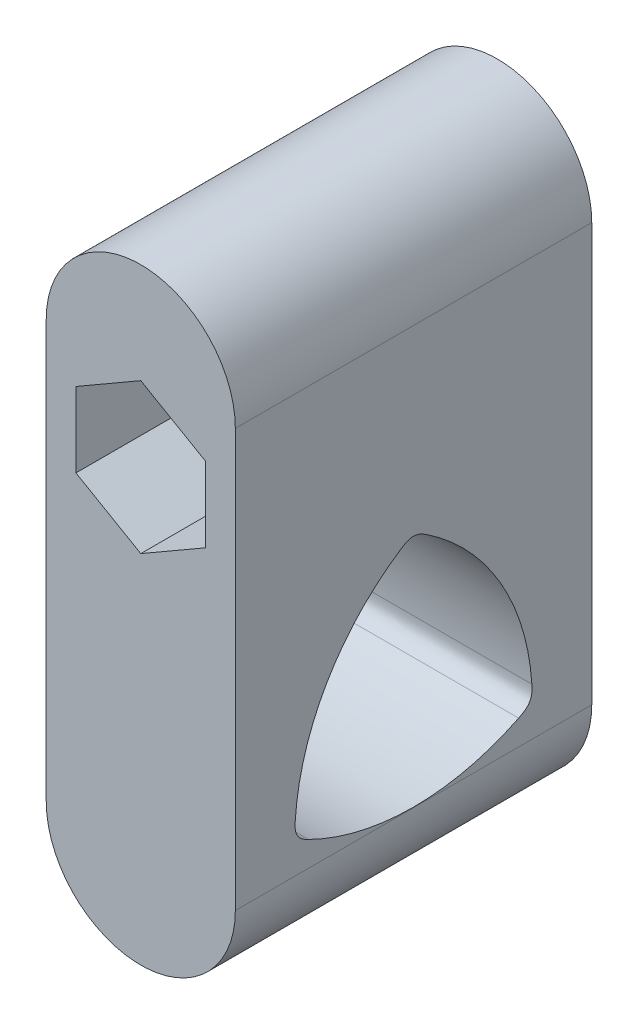
ISO-10303-21;
HEADER;
FILE_DESCRIPTION(('STEP AP214'),'2;1');
FILE_NAME('part.step','',(''),(''),'','','');
FILE_SCHEMA(('AUTOMOTIVE_DESIGN { 1 0 10303 214 1 1 1 1 }'));
ENDSEC;
DATA;
#1=APPLICATION_CONTEXT('core data for automotive mechanical design processes');
#2=APPLICATION_PROTOCOL_DEFINITION('international standard','automotive_design',2000,#1);
#3=PRODUCT_CONTEXT('',#1,'mechanical');
#4=PRODUCT('Part','Part','',(#3));
#5=PRODUCT_RELATED_PRODUCT_CATEGORY('part','',(#4));
#6=PRODUCT_DEFINITION_FORMATION('','',#4);
#7=PRODUCT_DEFINITION_CONTEXT('part definition',#1,'design');
#8=PRODUCT_DEFINITION('design','',#6,#7);
#9=PRODUCT_DEFINITION_SHAPE('','',#8);
#10=(LENGTH_UNIT() NAMED_UNIT(*) SI_UNIT(.MILLI.,.METRE.));
#11=(NAMED_UNIT(*) PLANE_ANGLE_UNIT() SI_UNIT($,.RADIAN.));
#12=(NAMED_UNIT(*) SI_UNIT($,.STERADIAN.) SOLID_ANGLE_UNIT());
#13=UNCERTAINTY_MEASURE_WITH_UNIT(LENGTH_MEASURE(1.E-05),#10,'distance_accuracy_value','');
#14=(GEOMETRIC_REPRESENTATION_CONTEXT(3) GLOBAL_UNCERTAINTY_ASSIGNED_CONTEXT((#13)) GLOBAL_UNIT_ASSIGNED_CONTEXT((#10,
#11,#12)) REPRESENTATION_CONTEXT('',''));
#15=CARTESIAN_POINT('',(0.,0.,0.));
#16=DIRECTION('',(0.,0.,1.));
#17=DIRECTION('',(1.,0.,0.));
#18=AXIS2_PLACEMENT_3D('',#15,#16,#17);
#19=CARTESIAN_POINT('',(0.,-34.0132885263841,18.));
#20=DIRECTION('',(0.,0.,1.));
#21=DIRECTION('',(1.,0.,0.));
#22=AXIS2_PLACEMENT_3D('',#19,#20,#21);
#23=PLANE('',#22);
#24=CARTESIAN_POINT('',(0.,-34.0132885263841,18.));
#25=DIRECTION('',(0.,0.,1.));
#26=DIRECTION('',(1.,0.,0.));
#27=AXIS2_PLACEMENT_3D('',#24,#25,#26);
#28=CIRCLE('',#27,9.55);
#29=CARTESIAN_POINT('',(-9.54999999999999,-34.0132885263841,18.));
#30=VERTEX_POINT('',#29);
#31=CARTESIAN_POINT('',(9.55,-34.0132885263841,18.));
#32=VERTEX_POINT('',#31);
#33=EDGE_CURVE('E216',#30,#32,#28,.T.);
#34=ORIENTED_EDGE('',*,*,#33,.T.);
#35=DIRECTION('',(0.,1.,0.));
#36=VECTOR('',#35,1.);
#37=CARTESIAN_POINT('',(9.55,-34.0132885263841,18.));
#38=LINE('',#37,#36);
#39=CARTESIAN_POINT('',(9.55,8.1632885263841,18.));
#40=VERTEX_POINT('',#39);
#41=EDGE_CURVE('E219',#32,#40,#38,.T.);
#42=ORIENTED_EDGE('',*,*,#41,.T.);
#43=CARTESIAN_POINT('',(0.,8.1632885263841,18.));
#44=DIRECTION('',(0.,0.,1.));
#45=DIRECTION('',(1.,0.,0.));
#46=AXIS2_PLACEMENT_3D('',#43,#44,#45);
#47=CIRCLE('',#46,9.55);
#48=CARTESIAN_POINT('',(-9.55,8.1632885263841,18.));
#49=VERTEX_POINT('',#48);
#50=EDGE_CURVE('E222',#40,#49,#47,.T.);
#51=ORIENTED_EDGE('',*,*,#50,.T.);
#52=DIRECTION('',(0.,-1.,0.));
#53=VECTOR('',#52,1.);
#54=CARTESIAN_POINT('',(-9.55,8.1632885263841,18.));
#55=LINE('',#54,#53);
#56=EDGE_CURVE('E224',#49,#30,#55,.T.);
#57=ORIENTED_EDGE('',*,*,#56,.T.);
#58=EDGE_LOOP('',(#34,#42,#51,#57));
#59=FACE_BOUND('',#58,.T.);
#60=DIRECTION('',(0.,1.,0.));
#61=VECTOR('',#60,1.);
#62=CARTESIAN_POINT('',(6.55,-3.78164426319204,18.));
#63=LINE('',#62,#61);
#64=CARTESIAN_POINT('',(6.55,-3.78164426319204,18.));
#65=VERTEX_POINT('',#64);
#66=CARTESIAN_POINT('',(6.55,3.78164426319205,18.));
#67=VERTEX_POINT('',#66);
#68=EDGE_CURVE('E168',#65,#67,#63,.T.);
#69=ORIENTED_EDGE('',*,*,#68,.F.);
#70=DIRECTION('',(0.866025403784438,0.500000000000001,0.));
#71=VECTOR('',#70,1.);
#72=CARTESIAN_POINT('',(0.,-7.5632885263841,18.));
#73=LINE('',#72,#71);
#74=CARTESIAN_POINT('',(0.,-7.5632885263841,18.));
#75=VERTEX_POINT('',#74);
#76=EDGE_CURVE('E158',#75,#65,#73,.T.);
#77=ORIENTED_EDGE('',*,*,#76,.F.);
#78=DIRECTION('',(0.866025403784439,-0.5,0.));
#79=VECTOR('',#78,1.);
#80=CARTESIAN_POINT('',(-6.55,-3.78164426319205,18.));
#81=LINE('',#80,#79);
#82=CARTESIAN_POINT('',(-6.54999999999999,-3.78164426319205,18.));
#83=VERTEX_POINT('',#82);
#84=EDGE_CURVE('E191',#83,#75,#81,.T.);
#85=ORIENTED_EDGE('',*,*,#84,.F.);
#86=DIRECTION('',(0.,-1.,0.));
#87=VECTOR('',#86,1.);
#88=CARTESIAN_POINT('',(-6.55,3.78164426319205,18.));
#89=LINE('',#88,#87);
#90=CARTESIAN_POINT('',(-6.55,3.78164426319205,18.));
#91=VERTEX_POINT('',#90);
#92=EDGE_CURVE('E188',#91,#83,#89,.T.);
#93=ORIENTED_EDGE('',*,*,#92,.F.);
#94=DIRECTION('',(-0.866025403784439,-0.5,0.));
#95=VECTOR('',#94,1.);
#96=CARTESIAN_POINT('',(0.,7.5632885263841,18.));
#97=LINE('',#96,#95);
#98=CARTESIAN_POINT('',(0.,7.5632885263841,18.));
#99=VERTEX_POINT('',#98);
#100=EDGE_CURVE('E183',#99,#91,#97,.T.);
#101=ORIENTED_EDGE('',*,*,#100,.F.);
#102=DIRECTION('',(-0.866025403784439,0.5,0.));
#103=VECTOR('',#102,1.);
#104=CARTESIAN_POINT('',(6.55,3.78164426319205,18.));
#105=LINE('',#104,#103);
#106=EDGE_CURVE('E181',#67,#99,#105,.T.);
#107=ORIENTED_EDGE('',*,*,#106,.F.);
#108=EDGE_LOOP('',(#69,#77,#85,#93,#101,#107));
#109=FACE_BOUND('',#108,.T.);
#110=ADVANCED_FACE('F35',(#59,#109),#23,.T.);
#111=CARTESIAN_POINT('',(0.,-34.0132885263841,-18.));
#112=DIRECTION('',(0.,0.,1.));
#113=DIRECTION('',(1.,0.,0.));
#114=AXIS2_PLACEMENT_3D('',#111,#112,#113);
#115=PLANE('',#114);
#116=CARTESIAN_POINT('',(0.,-34.0132885263841,-18.));
#117=DIRECTION('',(0.,0.,1.));
#118=DIRECTION('',(1.,0.,0.));
#119=AXIS2_PLACEMENT_3D('',#116,#117,#118);
#120=CIRCLE('',#119,9.55);
#121=CARTESIAN_POINT('',(-9.54999999999999,-34.0132885263841,-18.));
#122=VERTEX_POINT('',#121);
#123=CARTESIAN_POINT('',(9.55,-34.0132885263841,-18.));
#124=VERTEX_POINT('',#123);
#125=EDGE_CURVE('E176',#122,#124,#120,.T.);
#126=ORIENTED_EDGE('',*,*,#125,.F.);
#127=DIRECTION('',(0.,-1.,0.));
#128=VECTOR('',#127,1.);
#129=CARTESIAN_POINT('',(-9.55,8.1632885263841,-18.));
#130=LINE('',#129,#128);
#131=CARTESIAN_POINT('',(-9.55,8.1632885263841,-18.));
#132=VERTEX_POINT('',#131);
#133=EDGE_CURVE('E220',#132,#122,#130,.T.);
#134=ORIENTED_EDGE('',*,*,#133,.F.);
#135=CARTESIAN_POINT('',(0.,8.1632885263841,-18.));
#136=DIRECTION('',(0.,0.,1.));
#137=DIRECTION('',(1.,0.,0.));
#138=AXIS2_PLACEMENT_3D('',#135,#136,#137);
#139=CIRCLE('',#138,9.55);
#140=CARTESIAN_POINT('',(9.55,8.1632885263841,-18.));
#141=VERTEX_POINT('',#140);
#142=EDGE_CURVE('E231',#141,#132,#139,.T.);
#143=ORIENTED_EDGE('',*,*,#142,.F.);
#144=DIRECTION('',(0.,1.,0.));
#145=VECTOR('',#144,1.);
#146=CARTESIAN_POINT('',(9.55,-34.0132885263841,-18.));
#147=LINE('',#146,#145);
#148=EDGE_CURVE('E229',#124,#141,#147,.T.);
#149=ORIENTED_EDGE('',*,*,#148,.F.);
#150=EDGE_LOOP('',(#126,#134,#143,#149));
#151=FACE_BOUND('',#150,.T.);
#152=DIRECTION('',(0.866025403784438,0.500000000000001,0.));
#153=VECTOR('',#152,1.);
#154=CARTESIAN_POINT('',(0.,-7.5632885263841,-18.));
#155=LINE('',#154,#153);
#156=CARTESIAN_POINT('',(0.,-7.5632885263841,-18.));
#157=VERTEX_POINT('',#156);
#158=CARTESIAN_POINT('',(6.55,-3.78164426319204,-18.));
#159=VERTEX_POINT('',#158);
#160=EDGE_CURVE('E193',#157,#159,#155,.T.);
#161=ORIENTED_EDGE('',*,*,#160,.T.);
#162=DIRECTION('',(0.,1.,0.));
#163=VECTOR('',#162,1.);
#164=CARTESIAN_POINT('',(6.55,-3.78164426319204,-18.));
#165=LINE('',#164,#163);
#166=CARTESIAN_POINT('',(6.55,3.78164426319205,-18.));
#167=VERTEX_POINT('',#166);
#168=EDGE_CURVE('E175',#159,#167,#165,.T.);
#169=ORIENTED_EDGE('',*,*,#168,.T.);
#170=DIRECTION('',(-0.866025403784439,0.5,0.));
#171=VECTOR('',#170,1.);
#172=CARTESIAN_POINT('',(6.55,3.78164426319205,-18.));
#173=LINE('',#172,#171);
#174=CARTESIAN_POINT('',(0.,7.5632885263841,-18.));
#175=VERTEX_POINT('',#174);
#176=EDGE_CURVE('E197',#167,#175,#173,.T.);
#177=ORIENTED_EDGE('',*,*,#176,.T.);
#178=DIRECTION('',(-0.866025403784439,-0.5,0.));
#179=VECTOR('',#178,1.);
#180=CARTESIAN_POINT('',(0.,7.5632885263841,-18.));
#181=LINE('',#180,#179);
#182=CARTESIAN_POINT('',(-6.55,3.78164426319205,-18.));
#183=VERTEX_POINT('',#182);
#184=EDGE_CURVE('E200',#175,#183,#181,.T.);
#185=ORIENTED_EDGE('',*,*,#184,.T.);
#186=DIRECTION('',(0.,-1.,0.));
#187=VECTOR('',#186,1.);
#188=CARTESIAN_POINT('',(-6.55,3.78164426319205,-18.));
#189=LINE('',#188,#187);
#190=CARTESIAN_POINT('',(-6.55,-3.78164426319205,-18.));
#191=VERTEX_POINT('',#190);
#192=EDGE_CURVE('E203',#183,#191,#189,.T.);
#193=ORIENTED_EDGE('',*,*,#192,.T.);
#194=DIRECTION('',(0.866025403784439,-0.5,0.));
#195=VECTOR('',#194,1.);
#196=CARTESIAN_POINT('',(-6.55,-3.78164426319205,-18.));
#197=LINE('',#196,#195);
#198=EDGE_CURVE('E169',#191,#157,#197,.T.);
#199=ORIENTED_EDGE('',*,*,#198,.T.);
#200=EDGE_LOOP('',(#161,#169,#177,#185,#193,#199));
#201=FACE_BOUND('',#200,.T.);
#202=ADVANCED_FACE('F356',(#151,#201),#115,.F.);
#203=CARTESIAN_POINT('',(0.,-34.0132885263841,18.));
#204=DIRECTION('',(0.,0.,-1.));
#205=DIRECTION('',(-1.,0.,0.));
#206=AXIS2_PLACEMENT_3D('',#203,#204,#205);
#207=CYLINDRICAL_SURFACE('',#206,9.55);
#208=ORIENTED_EDGE('',*,*,#125,.T.);
#209=DIRECTION('',(0.,0.,-1.));
#210=VECTOR('',#209,1.);
#211=CARTESIAN_POINT('',(9.55,-34.0132885263841,18.));
#212=LINE('',#211,#210);
#213=EDGE_CURVE('E242',#32,#124,#212,.T.);
#214=ORIENTED_EDGE('',*,*,#213,.F.);
#215=ORIENTED_EDGE('',*,*,#33,.F.);
#216=DIRECTION('',(0.,0.,-1.));
#217=VECTOR('',#216,1.);
#218=CARTESIAN_POINT('',(-9.54999999999999,-34.0132885263841,18.));
#219=LINE('',#218,#217);
#220=EDGE_CURVE('E226',#30,#122,#219,.T.);
#221=ORIENTED_EDGE('',*,*,#220,.T.);
#222=EDGE_LOOP('',(#208,#214,#215,#221));
#223=FACE_BOUND('',#222,.T.);
#224=ADVANCED_FACE('F325',(#223),#207,.T.);
#225=CARTESIAN_POINT('',(9.55,-34.0132885263841,18.));
#226=DIRECTION('',(-1.,0.,0.));
#227=DIRECTION('',(0.,-1.,0.));
#228=AXIS2_PLACEMENT_3D('',#225,#226,#227);
#229=PLANE('',#228);
#230=CARTESIAN_POINT('',(9.55,-30.7478982172106,-12.));
#231=DIRECTION('',(1.,0.,0.));
#232=DIRECTION('',(0.,1.,0.));
#233=AXIS2_PLACEMENT_3D('',#230,#231,#232);
#234=CIRCLE('',#233,24.);
#235=CARTESIAN_POINT('',(9.55,-10.7923921544163,1.33333333333334));
#236=VERTEX_POINT('',#235);
#237=CARTESIAN_POINT('',(9.55,-29.1786458648153,11.948641862421));
#238=VERTEX_POINT('',#237);
#239=EDGE_CURVE('E250',#236,#238,#234,.T.);
#240=ORIENTED_EDGE('',*,*,#239,.F.);
#241=CARTESIAN_POINT('',(9.55,-10.7923921544163,-1.33333333333333));
#242=CARTESIAN_POINT('',(9.55,-10.6287439620199,-1.08840714616853));
#243=CARTESIAN_POINT('',(9.55,-10.4709275379547,-0.844074503622201));
#244=CARTESIAN_POINT('',(9.55,-10.1981406973913,-0.281358167874068));
#245=CARTESIAN_POINT('',(9.55,-10.1981406973913,0.281358167874065));
#246=CARTESIAN_POINT('',(9.55,-10.4709275379547,0.844074503622197));
#247=CARTESIAN_POINT('',(9.55,-10.6287439620199,1.08840714616853));
#248=CARTESIAN_POINT('',(9.55,-10.7923921544163,1.33333333333333));
#249=B_SPLINE_CURVE_WITH_KNOTS('',5,(#241,#242,#243,#244,#245,#246,#247,#248),.UNSPECIFIED.,.F.,
.F.,(6,2,6),(0.,0.5,1.),.UNSPECIFIED.);
#250=CARTESIAN_POINT('',(9.55,-10.7923921544163,-1.33333333333334));
#251=VERTEX_POINT('',#250);
#252=EDGE_CURVE('E437',#236,#251,#249,.F.);
#253=ORIENTED_EDGE('',*,*,#252,.T.);
#254=CARTESIAN_POINT('',(9.55,-30.7478982172106,12.));
#255=DIRECTION('',(1.,0.,0.));
#256=DIRECTION('',(0.,1.,0.));
#257=AXIS2_PLACEMENT_3D('',#254,#255,#256);
#258=CIRCLE('',#257,24.);
#259=CARTESIAN_POINT('',(9.55,-29.1786458648153,-11.948641862421));
#260=VERTEX_POINT('',#259);
#261=EDGE_CURVE('E246',#260,#251,#258,.T.);
#262=ORIENTED_EDGE('',*,*,#261,.F.);
#263=CARTESIAN_POINT('',(9.55,-31.4880469415738,-10.6153085290876));
#264=CARTESIAN_POINT('',(9.55,-31.3577587376352,-10.8794951145687));
#265=CARTESIAN_POINT('',(9.55,-31.2250686742489,-11.1383344682168));
#266=CARTESIAN_POINT('',(9.55,-30.8741354526482,-11.6559329698368));
#267=CARTESIAN_POINT('',(9.55,-30.3868088107658,-11.9372911377109));
#268=CARTESIAN_POINT('',(9.55,-29.7630887486018,-11.9824089718389));
#269=CARTESIAN_POINT('',(9.55,-29.4725822611502,-11.9679022607372));
#270=CARTESIAN_POINT('',(9.55,-29.1786458648153,-11.948641862421));
#271=B_SPLINE_CURVE_WITH_KNOTS('',5,(#263,#264,#265,#266,#267,#268,#269,#270),.UNSPECIFIED.,.F.,
.F.,(6,2,6),(0.,0.5,1.),.UNSPECIFIED.);
#272=CARTESIAN_POINT('',(9.55,-31.4880469415738,-10.6153085290876));
#273=VERTEX_POINT('',#272);
#274=EDGE_CURVE('E307',#260,#273,#271,.F.);
#275=ORIENTED_EDGE('',*,*,#274,.T.);
#276=CARTESIAN_POINT('',(9.55,-9.9632885263841,0.));
#277=DIRECTION('',(1.,0.,0.));
#278=DIRECTION('',(0.,-1.,0.));
#279=AXIS2_PLACEMENT_3D('',#276,#277,#278);
#280=CIRCLE('',#279,24.);
#281=CARTESIAN_POINT('',(9.55,-31.4880469415738,10.6153085290876));
#282=VERTEX_POINT('',#281);
#283=EDGE_CURVE('E264',#282,#273,#280,.T.);
#284=ORIENTED_EDGE('',*,*,#283,.F.);
#285=CARTESIAN_POINT('',(9.55,-29.1786458648153,11.948641862421));
#286=CARTESIAN_POINT('',(9.55,-29.4725822611502,11.9679022607372));
#287=CARTESIAN_POINT('',(9.55,-29.7630887486018,11.9824089718389));
#288=CARTESIAN_POINT('',(9.55,-30.3868088107658,11.9372911377109));
#289=CARTESIAN_POINT('',(9.55,-30.8741354526482,11.6559329698368));
#290=CARTESIAN_POINT('',(9.55,-31.2250686742489,11.1383344682167));
#291=CARTESIAN_POINT('',(9.55,-31.3577587376352,10.8794951145687));
#292=CARTESIAN_POINT('',(9.55,-31.4880469415738,10.6153085290876));
#293=B_SPLINE_CURVE_WITH_KNOTS('',5,(#285,#286,#287,#288,#289,#290,#291,#292),.UNSPECIFIED.,.F.,
.F.,(6,2,6),(0.,0.5,1.),.UNSPECIFIED.);
#294=EDGE_CURVE('E49',#282,#238,#293,.F.);
#295=ORIENTED_EDGE('',*,*,#294,.T.);
#296=EDGE_LOOP('',(#240,#253,#262,#275,#284,#295));
#297=FACE_BOUND('',#296,.T.);
#298=ORIENTED_EDGE('',*,*,#148,.T.);
#299=DIRECTION('',(0.,0.,-1.));
#300=VECTOR('',#299,1.);
#301=CARTESIAN_POINT('',(9.55,8.1632885263841,18.));
#302=LINE('',#301,#300);
#303=EDGE_CURVE('E239',#40,#141,#302,.T.);
#304=ORIENTED_EDGE('',*,*,#303,.F.);
#305=ORIENTED_EDGE('',*,*,#41,.F.);
#306=ORIENTED_EDGE('',*,*,#213,.T.);
#307=EDGE_LOOP('',(#298,#304,#305,#306));
#308=FACE_BOUND('',#307,.T.);
#309=ADVANCED_FACE('F314',(#297,#308),#229,.F.);
#310=CARTESIAN_POINT('',(0.,8.1632885263841,18.));
#311=DIRECTION('',(0.,0.,-1.));
#312=DIRECTION('',(-1.,0.,0.));
#313=AXIS2_PLACEMENT_3D('',#310,#311,#312);
#314=CYLINDRICAL_SURFACE('',#313,9.55);
#315=ORIENTED_EDGE('',*,*,#142,.T.);
#316=DIRECTION('',(0.,0.,-1.));
#317=VECTOR('',#316,1.);
#318=CARTESIAN_POINT('',(-9.55,8.1632885263841,18.));
#319=LINE('',#318,#317);
#320=EDGE_CURVE('E236',#49,#132,#319,.T.);
#321=ORIENTED_EDGE('',*,*,#320,.F.);
#322=ORIENTED_EDGE('',*,*,#50,.F.);
#323=ORIENTED_EDGE('',*,*,#303,.T.);
#324=EDGE_LOOP('',(#315,#321,#322,#323));
#325=FACE_BOUND('',#324,.T.);
#326=ADVANCED_FACE('F324',(#325),#314,.T.);
#327=CARTESIAN_POINT('',(-9.55,8.1632885263841,18.));
#328=DIRECTION('',(1.,0.,0.));
#329=DIRECTION('',(0.,1.,0.));
#330=AXIS2_PLACEMENT_3D('',#327,#328,#329);
#331=PLANE('',#330);
#332=CARTESIAN_POINT('',(-9.55,-30.7478982172106,-12.));
#333=DIRECTION('',(1.,0.,0.));
#334=DIRECTION('',(0.,1.,0.));
#335=AXIS2_PLACEMENT_3D('',#332,#333,#334);
#336=CIRCLE('',#335,24.);
#337=CARTESIAN_POINT('',(-9.55,-10.7923921544163,1.33333333333334));
#338=VERTEX_POINT('',#337);
#339=CARTESIAN_POINT('',(-9.55,-29.1786458648153,11.948641862421));
#340=VERTEX_POINT('',#339);
#341=EDGE_CURVE('E269',#338,#340,#336,.T.);
#342=ORIENTED_EDGE('',*,*,#341,.T.);
#343=CARTESIAN_POINT('',(-9.54999999999999,-31.4880469415738,10.6153085290876));
#344=CARTESIAN_POINT('',(-9.54999999999999,-31.3577587376352,10.8794951145687));
#345=CARTESIAN_POINT('',(-9.54999999999999,-31.2250686742489,11.1383344682167));
#346=CARTESIAN_POINT('',(-9.54999999999999,-30.8741354526482,11.6559329698368));
#347=CARTESIAN_POINT('',(-9.54999999999999,-30.3868088107658,11.9372911377108));
#348=CARTESIAN_POINT('',(-9.54999999999999,-29.7630887486018,11.9824089718389));
#349=CARTESIAN_POINT('',(-9.54999999999999,-29.4725822611502,11.9679022607372));
#350=CARTESIAN_POINT('',(-9.54999999999999,-29.1786458648153,11.948641862421));
#351=B_SPLINE_CURVE_WITH_KNOTS('',5,(#343,#344,#345,#346,#347,#348,#349,#350),.UNSPECIFIED.,.F.,
.F.,(6,2,6),(0.,0.5,1.),.UNSPECIFIED.);
#352=CARTESIAN_POINT('',(-9.55,-31.4880469415738,10.6153085290876));
#353=VERTEX_POINT('',#352);
#354=EDGE_CURVE('E11',#340,#353,#351,.F.);
#355=ORIENTED_EDGE('',*,*,#354,.T.);
#356=CARTESIAN_POINT('',(-9.55,-9.9632885263841,0.));
#357=DIRECTION('',(1.,0.,0.));
#358=DIRECTION('',(0.,-1.,0.));
#359=AXIS2_PLACEMENT_3D('',#356,#357,#358);
#360=CIRCLE('',#359,24.);
#361=CARTESIAN_POINT('',(-9.55,-31.4880469415738,-10.6153085290876));
#362=VERTEX_POINT('',#361);
#363=EDGE_CURVE('E195',#353,#362,#360,.T.);
#364=ORIENTED_EDGE('',*,*,#363,.T.);
#365=CARTESIAN_POINT('',(-9.54999999999999,-29.1786458648153,-11.948641862421));
#366=CARTESIAN_POINT('',(-9.54999999999999,-29.4725822611503,-11.9679022607372));
#367=CARTESIAN_POINT('',(-9.54999999999999,-29.7630887486018,-11.9824089718389));
#368=CARTESIAN_POINT('',(-9.54999999999999,-30.3868088107658,-11.9372911377109));
#369=CARTESIAN_POINT('',(-9.54999999999999,-30.8741354526482,-11.6559329698368));
#370=CARTESIAN_POINT('',(-9.54999999999999,-31.2250686742489,-11.1383344682167));
#371=CARTESIAN_POINT('',(-9.54999999999999,-31.3577587376352,-10.8794951145687));
#372=CARTESIAN_POINT('',(-9.54999999999999,-31.4880469415738,-10.6153085290876));
#373=B_SPLINE_CURVE_WITH_KNOTS('',5,(#365,#366,#367,#368,#369,#370,#371,#372),.UNSPECIFIED.,.F.,
.F.,(6,2,6),(0.,0.5,1.),.UNSPECIFIED.);
#374=CARTESIAN_POINT('',(-9.55,-29.1786458648153,-11.948641862421));
#375=VERTEX_POINT('',#374);
#376=EDGE_CURVE('E515',#362,#375,#373,.F.);
#377=ORIENTED_EDGE('',*,*,#376,.T.);
#378=CARTESIAN_POINT('',(-9.55,-30.7478982172106,12.));
#379=DIRECTION('',(1.,0.,0.));
#380=DIRECTION('',(0.,1.,0.));
#381=AXIS2_PLACEMENT_3D('',#378,#379,#380);
#382=CIRCLE('',#381,24.);
#383=CARTESIAN_POINT('',(-9.55,-10.7923921544163,-1.33333333333334));
#384=VERTEX_POINT('',#383);
#385=EDGE_CURVE('E251',#375,#384,#382,.T.);
#386=ORIENTED_EDGE('',*,*,#385,.T.);
#387=CARTESIAN_POINT('',(-9.55,-10.7923921544163,1.33333333333333));
#388=CARTESIAN_POINT('',(-9.55,-10.6287439620199,1.08840714616853));
#389=CARTESIAN_POINT('',(-9.55,-10.4709275379547,0.844074503622196));
#390=CARTESIAN_POINT('',(-9.55,-10.1981406973913,0.281358167874064));
#391=CARTESIAN_POINT('',(-9.55,-10.1981406973913,-0.281358167874067));
#392=CARTESIAN_POINT('',(-9.55,-10.4709275379547,-0.844074503622199));
#393=CARTESIAN_POINT('',(-9.55,-10.6287439620199,-1.08840714616853));
#394=CARTESIAN_POINT('',(-9.55,-10.7923921544163,-1.33333333333333));
#395=B_SPLINE_CURVE_WITH_KNOTS('',5,(#387,#388,#389,#390,#391,#392,#393,#394),.UNSPECIFIED.,.F.,
.F.,(6,2,6),(0.,0.5,1.),.UNSPECIFIED.);
#396=EDGE_CURVE('E64',#384,#338,#395,.F.);
#397=ORIENTED_EDGE('',*,*,#396,.T.);
#398=EDGE_LOOP('',(#342,#355,#364,#377,#386,#397));
#399=FACE_BOUND('',#398,.T.);
#400=ORIENTED_EDGE('',*,*,#133,.T.);
#401=ORIENTED_EDGE('',*,*,#220,.F.);
#402=ORIENTED_EDGE('',*,*,#56,.F.);
#403=ORIENTED_EDGE('',*,*,#320,.T.);
#404=EDGE_LOOP('',(#400,#401,#402,#403));
#405=FACE_BOUND('',#404,.T.);
#406=ADVANCED_FACE('F347',(#399,#405),#331,.F.);
#407=CARTESIAN_POINT('',(0.,-7.5632885263841,18.));
#408=DIRECTION('',(-0.500000000000001,0.866025403784438,0.));
#409=DIRECTION('',(-0.866025403784438,-0.500000000000001,0.));
#410=AXIS2_PLACEMENT_3D('',#407,#408,#409);
#411=PLANE('',#410);
#412=ORIENTED_EDGE('',*,*,#160,.F.);
#413=DIRECTION('',(0.,0.,-1.));
#414=VECTOR('',#413,1.);
#415=CARTESIAN_POINT('',(0.,-7.5632885263841,18.));
#416=LINE('',#415,#414);
#417=EDGE_CURVE('E164',#75,#157,#416,.T.);
#418=ORIENTED_EDGE('',*,*,#417,.F.);
#419=ORIENTED_EDGE('',*,*,#76,.T.);
#420=DIRECTION('',(0.,0.,-1.));
#421=VECTOR('',#420,1.);
#422=CARTESIAN_POINT('',(6.55,-3.78164426319204,18.));
#423=LINE('',#422,#421);
#424=EDGE_CURVE('E161',#65,#159,#423,.T.);
#425=ORIENTED_EDGE('',*,*,#424,.T.);
#426=EDGE_LOOP('',(#412,#418,#419,#425));
#427=FACE_BOUND('',#426,.T.);
#428=ADVANCED_FACE('F160',(#427),#411,.T.);
#429=CARTESIAN_POINT('',(6.55,-3.78164426319204,18.));
#430=DIRECTION('',(-1.,0.,0.));
#431=DIRECTION('',(0.,-1.,0.));
#432=AXIS2_PLACEMENT_3D('',#429,#430,#431);
#433=PLANE('',#432);
#434=ORIENTED_EDGE('',*,*,#168,.F.);
#435=ORIENTED_EDGE('',*,*,#424,.F.);
#436=ORIENTED_EDGE('',*,*,#68,.T.);
#437=DIRECTION('',(0.,0.,-1.));
#438=VECTOR('',#437,1.);
#439=CARTESIAN_POINT('',(6.55,3.78164426319205,18.));
#440=LINE('',#439,#438);
#441=EDGE_CURVE('E177',#67,#167,#440,.T.);
#442=ORIENTED_EDGE('',*,*,#441,.T.);
#443=EDGE_LOOP('',(#434,#435,#436,#442));
#444=FACE_BOUND('',#443,.T.);
#445=ADVANCED_FACE('F172',(#444),#433,.T.);
#446=CARTESIAN_POINT('',(6.55,3.78164426319205,18.));
#447=DIRECTION('',(-0.5,-0.866025403784439,0.));
#448=DIRECTION('',(0.866025403784439,-0.5,0.));
#449=AXIS2_PLACEMENT_3D('',#446,#447,#448);
#450=PLANE('',#449);
#451=ORIENTED_EDGE('',*,*,#176,.F.);
#452=ORIENTED_EDGE('',*,*,#441,.F.);
#453=ORIENTED_EDGE('',*,*,#106,.T.);
#454=DIRECTION('',(0.,0.,-1.));
#455=VECTOR('',#454,1.);
#456=CARTESIAN_POINT('',(0.,7.5632885263841,18.));
#457=LINE('',#456,#455);
#458=EDGE_CURVE('E213',#99,#175,#457,.T.);
#459=ORIENTED_EDGE('',*,*,#458,.T.);
#460=EDGE_LOOP('',(#451,#452,#453,#459));
#461=FACE_BOUND('',#460,.T.);
#462=ADVANCED_FACE('F555',(#461),#450,.T.);
#463=CARTESIAN_POINT('',(0.,7.5632885263841,18.));
#464=DIRECTION('',(0.5,-0.866025403784438,0.));
#465=DIRECTION('',(0.866025403784439,0.5,0.));
#466=AXIS2_PLACEMENT_3D('',#463,#464,#465);
#467=PLANE('',#466);
#468=ORIENTED_EDGE('',*,*,#184,.F.);
#469=ORIENTED_EDGE('',*,*,#458,.F.);
#470=ORIENTED_EDGE('',*,*,#100,.T.);
#471=DIRECTION('',(0.,0.,-1.));
#472=VECTOR('',#471,1.);
#473=CARTESIAN_POINT('',(-6.55,3.78164426319205,18.));
#474=LINE('',#473,#472);
#475=EDGE_CURVE('E211',#91,#183,#474,.T.);
#476=ORIENTED_EDGE('',*,*,#475,.T.);
#477=EDGE_LOOP('',(#468,#469,#470,#476));
#478=FACE_BOUND('',#477,.T.);
#479=ADVANCED_FACE('F558',(#478),#467,.T.);
#480=CARTESIAN_POINT('',(-6.55,3.78164426319205,18.));
#481=DIRECTION('',(1.,0.,0.));
#482=DIRECTION('',(0.,1.,0.));
#483=AXIS2_PLACEMENT_3D('',#480,#481,#482);
#484=PLANE('',#483);
#485=ORIENTED_EDGE('',*,*,#192,.F.);
#486=ORIENTED_EDGE('',*,*,#475,.F.);
#487=ORIENTED_EDGE('',*,*,#92,.T.);
#488=DIRECTION('',(0.,0.,-1.));
#489=VECTOR('',#488,1.);
#490=CARTESIAN_POINT('',(-6.55,-3.78164426319205,18.));
#491=LINE('',#490,#489);
#492=EDGE_CURVE('E209',#83,#191,#491,.T.);
#493=ORIENTED_EDGE('',*,*,#492,.T.);
#494=EDGE_LOOP('',(#485,#486,#487,#493));
#495=FACE_BOUND('',#494,.T.);
#496=ADVANCED_FACE('F562',(#495),#484,.T.);
#497=CARTESIAN_POINT('',(-6.55,-3.78164426319205,18.));
#498=DIRECTION('',(0.5,0.866025403784439,0.));
#499=DIRECTION('',(-0.866025403784439,0.5,0.));
#500=AXIS2_PLACEMENT_3D('',#497,#498,#499);
#501=PLANE('',#500);
#502=ORIENTED_EDGE('',*,*,#198,.F.);
#503=ORIENTED_EDGE('',*,*,#492,.F.);
#504=ORIENTED_EDGE('',*,*,#84,.T.);
#505=ORIENTED_EDGE('',*,*,#417,.T.);
#506=EDGE_LOOP('',(#502,#503,#504,#505));
#507=FACE_BOUND('',#506,.T.);
#508=ADVANCED_FACE('F565',(#507),#501,.T.);
#509=CARTESIAN_POINT('',(-9.55,-30.7478982172106,12.));
#510=DIRECTION('',(1.,0.,0.));
#511=DIRECTION('',(0.,1.,0.));
#512=AXIS2_PLACEMENT_3D('',#509,#510,#511);
#513=CYLINDRICAL_SURFACE('',#512,24.);
#514=ORIENTED_EDGE('',*,*,#385,.F.);
#515=CARTESIAN_POINT('',(10.505,-29.1786458648153,-11.948641862421));
#516=CARTESIAN_POINT('',(3.50166666666667,-29.1786458648153,-11.948641862421));
#517=CARTESIAN_POINT('',(-3.50166666667805,-29.1786458648153,-11.948641862421));
#518=CARTESIAN_POINT('',(-10.505,-29.1786458648153,-11.948641862421));
#519=B_SPLINE_CURVE_WITH_KNOTS('',3,(#515,#516,#517,#518),.UNSPECIFIED.,.F.,.F.,(4,4),
(-0.020055,0.000955000000000002),.UNSPECIFIED.);
#520=EDGE_CURVE('E508',#375,#260,#519,.F.);
#521=ORIENTED_EDGE('',*,*,#520,.T.);
#522=ORIENTED_EDGE('',*,*,#261,.T.);
#523=CARTESIAN_POINT('',(-10.505,-10.7923921544163,-1.33333333333333));
#524=CARTESIAN_POINT('',(-3.50166666667806,-10.7923921544163,-1.33333333333334));
#525=CARTESIAN_POINT('',(3.50166666666667,-10.7923921544163,-1.33333333333333));
#526=CARTESIAN_POINT('',(10.505,-10.7923921544163,-1.33333333333333));
#527=B_SPLINE_CURVE_WITH_KNOTS('',3,(#523,#524,#525,#526),.UNSPECIFIED.,.F.,.F.,(4,4),
(-0.020055,0.000955000000000001),.UNSPECIFIED.);
#528=EDGE_CURVE('E245',#251,#384,#527,.F.);
#529=ORIENTED_EDGE('',*,*,#528,.T.);
#530=EDGE_LOOP('',(#514,#521,#522,#529));
#531=FACE_BOUND('',#530,.T.);
#532=ADVANCED_FACE('F291',(#531),#513,.F.);
#533=CARTESIAN_POINT('',(-9.55,-9.9632885263841,0.));
#534=DIRECTION('',(1.,0.,0.));
#535=DIRECTION('',(0.,1.,0.));
#536=AXIS2_PLACEMENT_3D('',#533,#534,#535);
#537=CYLINDRICAL_SURFACE('',#536,24.);
#538=ORIENTED_EDGE('',*,*,#283,.T.);
#539=CARTESIAN_POINT('',(-10.505,-31.4880469415738,-10.6153085290876));
#540=CARTESIAN_POINT('',(-3.50166666667805,-31.4880469415738,-10.6153085290876));
#541=CARTESIAN_POINT('',(3.50166666666667,-31.4880469415738,-10.6153085290876));
#542=CARTESIAN_POINT('',(10.505,-31.4880469415738,-10.6153085290876));
#543=B_SPLINE_CURVE_WITH_KNOTS('',3,(#539,#540,#541,#542),.UNSPECIFIED.,.F.,.F.,(4,4),
(-0.020055,0.000955000000000001),.UNSPECIFIED.);
#544=EDGE_CURVE('E424',#273,#362,#543,.F.);
#545=ORIENTED_EDGE('',*,*,#544,.T.);
#546=ORIENTED_EDGE('',*,*,#363,.F.);
#547=CARTESIAN_POINT('',(10.505,-31.4880469415738,10.6153085290876));
#548=CARTESIAN_POINT('',(3.50166666666667,-31.4880469415738,10.6153085290876));
#549=CARTESIAN_POINT('',(-3.50166666667805,-31.4880469415738,10.6153085290876));
#550=CARTESIAN_POINT('',(-10.505,-31.4880469415738,10.6153085290876));
#551=B_SPLINE_CURVE_WITH_KNOTS('',3,(#547,#548,#549,#550),.UNSPECIFIED.,.F.,.F.,(4,4),
(-0.020055,0.000955000000000002),.UNSPECIFIED.);
#552=EDGE_CURVE('E488',#353,#282,#551,.F.);
#553=ORIENTED_EDGE('',*,*,#552,.T.);
#554=EDGE_LOOP('',(#538,#545,#546,#553));
#555=FACE_BOUND('',#554,.T.);
#556=ADVANCED_FACE('F289',(#555),#537,.F.);
#557=CARTESIAN_POINT('',(-9.55,-30.7478982172106,-12.));
#558=DIRECTION('',(1.,0.,0.));
#559=DIRECTION('',(0.,1.,0.));
#560=AXIS2_PLACEMENT_3D('',#557,#558,#559);
#561=CYLINDRICAL_SURFACE('',#560,24.);
#562=ORIENTED_EDGE('',*,*,#341,.F.);
#563=CARTESIAN_POINT('',(10.505,-10.7923921544163,1.33333333333333));
#564=CARTESIAN_POINT('',(3.50166666666667,-10.7923921544163,1.33333333333333));
#565=CARTESIAN_POINT('',(-3.50166666667806,-10.7923921544163,1.33333333333333));
#566=CARTESIAN_POINT('',(-10.505,-10.7923921544163,1.33333333333333));
#567=B_SPLINE_CURVE_WITH_KNOTS('',3,(#563,#564,#565,#566),.UNSPECIFIED.,.F.,.F.,(4,4),
(-0.020055,0.000955),.UNSPECIFIED.);
#568=EDGE_CURVE('E447',#338,#236,#567,.F.);
#569=ORIENTED_EDGE('',*,*,#568,.T.);
#570=ORIENTED_EDGE('',*,*,#239,.T.);
#571=CARTESIAN_POINT('',(-10.505,-29.1786458648153,11.948641862421));
#572=CARTESIAN_POINT('',(-3.50166666667805,-29.1786458648153,11.948641862421));
#573=CARTESIAN_POINT('',(3.50166666666667,-29.1786458648153,11.948641862421));
#574=CARTESIAN_POINT('',(10.505,-29.1786458648153,11.948641862421));
#575=B_SPLINE_CURVE_WITH_KNOTS('',3,(#571,#572,#573,#574),.UNSPECIFIED.,.F.,.F.,(4,4),
(-0.020055,0.000955000000000001),.UNSPECIFIED.);
#576=EDGE_CURVE('E56',#238,#340,#575,.F.);
#577=ORIENTED_EDGE('',*,*,#576,.T.);
#578=EDGE_LOOP('',(#562,#569,#570,#577));
#579=FACE_BOUND('',#578,.T.);
#580=ADVANCED_FACE('F279',(#579),#561,.F.);
#581=CARTESIAN_POINT('',(10.505,-31.4880469415738,-10.6153085290876));
#582=CARTESIAN_POINT('',(3.50166666666667,-31.4880469415738,-10.6153085290876));
#583=CARTESIAN_POINT('',(-3.50166666667805,-31.4880469415738,-10.6153085290876));
#584=CARTESIAN_POINT('',(-10.505,-31.4880469415738,-10.6153085290876));
#585=CARTESIAN_POINT('',(10.505,-31.3577587376352,-10.8794951145687));
#586=CARTESIAN_POINT('',(3.50166666666667,-31.3577587376352,-10.8794951145687));
#587=CARTESIAN_POINT('',(-3.50166666667805,-31.3577587376352,-10.8794951145687));
#588=CARTESIAN_POINT('',(-10.505,-31.3577587376352,-10.8794951145687));
#589=CARTESIAN_POINT('',(10.505,-31.2250686742489,-11.1383344682167));
#590=CARTESIAN_POINT('',(3.50166666666667,-31.2250686742489,-11.1383344682167));
#591=CARTESIAN_POINT('',(-3.50166666667805,-31.2250686742489,-11.1383344682167));
#592=CARTESIAN_POINT('',(-10.505,-31.2250686742489,-11.1383344682167));
#593=CARTESIAN_POINT('',(10.505,-30.8741354526482,-11.6559329698368));
#594=CARTESIAN_POINT('',(3.50166666666667,-30.8741354526482,-11.6559329698368));
#595=CARTESIAN_POINT('',(-3.50166666667805,-30.8741354526482,-11.6559329698368));
#596=CARTESIAN_POINT('',(-10.505,-30.8741354526482,-11.6559329698368));
#597=CARTESIAN_POINT('',(10.505,-30.3868088107658,-11.9372911377109));
#598=CARTESIAN_POINT('',(3.50166666666667,-30.3868088107658,-11.9372911377109));
#599=CARTESIAN_POINT('',(-3.50166666667805,-30.3868088107658,-11.9372911377109));
#600=CARTESIAN_POINT('',(-10.505,-30.3868088107658,-11.9372911377109));
#601=CARTESIAN_POINT('',(10.505,-29.7630887486018,-11.9824089718389));
#602=CARTESIAN_POINT('',(3.50166666666667,-29.7630887486018,-11.9824089718389));
#603=CARTESIAN_POINT('',(-3.50166666667805,-29.7630887486018,-11.9824089718389));
#604=CARTESIAN_POINT('',(-10.505,-29.7630887486018,-11.9824089718389));
#605=CARTESIAN_POINT('',(10.505,-29.4725822611502,-11.9679022607372));
#606=CARTESIAN_POINT('',(3.50166666666667,-29.4725822611502,-11.9679022607372));
#607=CARTESIAN_POINT('',(-3.50166666667805,-29.4725822611503,-11.9679022607372));
#608=CARTESIAN_POINT('',(-10.505,-29.4725822611503,-11.9679022607372));
#609=CARTESIAN_POINT('',(10.505,-29.1786458648153,-11.948641862421));
#610=CARTESIAN_POINT('',(3.50166666666667,-29.1786458648153,-11.948641862421));
#611=CARTESIAN_POINT('',(-3.50166666667805,-29.1786458648153,-11.948641862421));
#612=CARTESIAN_POINT('',(-10.505,-29.1786458648153,-11.948641862421));
#613=B_SPLINE_SURFACE_WITH_KNOTS('',5,3,((#581,#582,#583,#584),(#585,#586,#587,#588),(#589,#590,
#591,#592),(#593,#594,#595,#596),(#597,#598,#599,#600),(#601,#602,#603,#604),(#605,#606,#607,
#608),(#609,#610,#611,#612)),.UNSPECIFIED.,.F.,.F.,.F.,(6,2,6),(4,4),(0.,0.5,1.),(-0.020055,
0.000955000000000002),.UNSPECIFIED.);
#614=ORIENTED_EDGE('',*,*,#376,.F.);
#615=ORIENTED_EDGE('',*,*,#544,.F.);
#616=ORIENTED_EDGE('',*,*,#274,.F.);
#617=ORIENTED_EDGE('',*,*,#520,.F.);
#618=EDGE_LOOP('',(#614,#615,#616,#617));
#619=FACE_BOUND('',#618,.T.);
#620=ADVANCED_FACE('F288',(#619),#613,.T.);
#621=CARTESIAN_POINT('',(10.505,-10.7923921544163,-1.33333333333333));
#622=CARTESIAN_POINT('',(3.50166666666667,-10.7923921544163,-1.33333333333333));
#623=CARTESIAN_POINT('',(-3.50166666667806,-10.7923921544163,-1.33333333333334));
#624=CARTESIAN_POINT('',(-10.505,-10.7923921544163,-1.33333333333333));
#625=CARTESIAN_POINT('',(10.505,-10.6287439620199,-1.08840714616853));
#626=CARTESIAN_POINT('',(3.50166666666667,-10.6287439620199,-1.08840714616853));
#627=CARTESIAN_POINT('',(-3.50166666667806,-10.6287439620199,-1.08840714616853));
#628=CARTESIAN_POINT('',(-10.505,-10.6287439620199,-1.08840714616853));
#629=CARTESIAN_POINT('',(10.505,-10.4709275379547,-0.844074503622201));
#630=CARTESIAN_POINT('',(3.50166666666667,-10.4709275379547,-0.844074503622201));
#631=CARTESIAN_POINT('',(-3.50166666667806,-10.4709275379547,-0.844074503622199));
#632=CARTESIAN_POINT('',(-10.505,-10.4709275379547,-0.844074503622199));
#633=CARTESIAN_POINT('',(10.505,-10.1981406973913,-0.281358167874068));
#634=CARTESIAN_POINT('',(3.50166666666667,-10.1981406973913,-0.281358167874068));
#635=CARTESIAN_POINT('',(-3.50166666667806,-10.1981406973913,-0.281358167874067));
#636=CARTESIAN_POINT('',(-10.505,-10.1981406973913,-0.281358167874067));
#637=CARTESIAN_POINT('',(10.505,-10.1981406973913,0.281358167874065));
#638=CARTESIAN_POINT('',(3.50166666666667,-10.1981406973913,0.281358167874065));
#639=CARTESIAN_POINT('',(-3.50166666667806,-10.1981406973913,0.281358167874064));
#640=CARTESIAN_POINT('',(-10.505,-10.1981406973913,0.281358167874064));
#641=CARTESIAN_POINT('',(10.505,-10.4709275379547,0.844074503622197));
#642=CARTESIAN_POINT('',(3.50166666666667,-10.4709275379547,0.844074503622197));
#643=CARTESIAN_POINT('',(-3.50166666667806,-10.4709275379547,0.844074503622196));
#644=CARTESIAN_POINT('',(-10.505,-10.4709275379547,0.844074503622196));
#645=CARTESIAN_POINT('',(10.505,-10.6287439620199,1.08840714616853));
#646=CARTESIAN_POINT('',(3.50166666666667,-10.6287439620199,1.08840714616853));
#647=CARTESIAN_POINT('',(-3.50166666667806,-10.6287439620199,1.08840714616853));
#648=CARTESIAN_POINT('',(-10.505,-10.6287439620199,1.08840714616853));
#649=CARTESIAN_POINT('',(10.505,-10.7923921544163,1.33333333333333));
#650=CARTESIAN_POINT('',(3.50166666666667,-10.7923921544163,1.33333333333333));
#651=CARTESIAN_POINT('',(-3.50166666667806,-10.7923921544163,1.33333333333333));
#652=CARTESIAN_POINT('',(-10.505,-10.7923921544163,1.33333333333333));
#653=B_SPLINE_SURFACE_WITH_KNOTS('',5,3,((#621,#622,#623,#624),(#625,#626,#627,#628),(#629,#630,
#631,#632),(#633,#634,#635,#636),(#637,#638,#639,#640),(#641,#642,#643,#644),(#645,#646,#647,
#648),(#649,#650,#651,#652)),.UNSPECIFIED.,.F.,.F.,.F.,(6,2,6),(4,4),(0.,0.5,1.),(-0.020055,
0.000955),.UNSPECIFIED.);
#654=ORIENTED_EDGE('',*,*,#396,.F.);
#655=ORIENTED_EDGE('',*,*,#528,.F.);
#656=ORIENTED_EDGE('',*,*,#252,.F.);
#657=ORIENTED_EDGE('',*,*,#568,.F.);
#658=EDGE_LOOP('',(#654,#655,#656,#657));
#659=FACE_BOUND('',#658,.T.);
#660=ADVANCED_FACE('F398',(#659),#653,.T.);
#661=CARTESIAN_POINT('',(10.505,-29.1786458648153,11.948641862421));
#662=CARTESIAN_POINT('',(3.50166666666667,-29.1786458648153,11.948641862421));
#663=CARTESIAN_POINT('',(-3.50166666667805,-29.1786458648153,11.948641862421));
#664=CARTESIAN_POINT('',(-10.505,-29.1786458648153,11.948641862421));
#665=CARTESIAN_POINT('',(10.505,-29.4725822611502,11.9679022607372));
#666=CARTESIAN_POINT('',(3.50166666666667,-29.4725822611502,11.9679022607372));
#667=CARTESIAN_POINT('',(-3.50166666667805,-29.4725822611503,11.9679022607372));
#668=CARTESIAN_POINT('',(-10.505,-29.4725822611503,11.9679022607372));
#669=CARTESIAN_POINT('',(10.505,-29.7630887486018,11.9824089718389));
#670=CARTESIAN_POINT('',(3.50166666666667,-29.7630887486018,11.9824089718389));
#671=CARTESIAN_POINT('',(-3.50166666667805,-29.7630887486018,11.9824089718389));
#672=CARTESIAN_POINT('',(-10.505,-29.7630887486018,11.9824089718389));
#673=CARTESIAN_POINT('',(10.505,-30.3868088107658,11.9372911377109));
#674=CARTESIAN_POINT('',(3.50166666666667,-30.3868088107658,11.9372911377109));
#675=CARTESIAN_POINT('',(-3.50166666667805,-30.3868088107658,11.9372911377108));
#676=CARTESIAN_POINT('',(-10.505,-30.3868088107658,11.9372911377108));
#677=CARTESIAN_POINT('',(10.505,-30.8741354526482,11.6559329698368));
#678=CARTESIAN_POINT('',(3.50166666666667,-30.8741354526482,11.6559329698368));
#679=CARTESIAN_POINT('',(-3.50166666667805,-30.8741354526482,11.6559329698368));
#680=CARTESIAN_POINT('',(-10.505,-30.8741354526482,11.6559329698368));
#681=CARTESIAN_POINT('',(10.505,-31.2250686742489,11.1383344682167));
#682=CARTESIAN_POINT('',(3.50166666666667,-31.2250686742489,11.1383344682167));
#683=CARTESIAN_POINT('',(-3.50166666667805,-31.2250686742489,11.1383344682167));
#684=CARTESIAN_POINT('',(-10.505,-31.2250686742489,11.1383344682167));
#685=CARTESIAN_POINT('',(10.505,-31.3577587376352,10.8794951145687));
#686=CARTESIAN_POINT('',(3.50166666666667,-31.3577587376352,10.8794951145687));
#687=CARTESIAN_POINT('',(-3.50166666667805,-31.3577587376352,10.8794951145687));
#688=CARTESIAN_POINT('',(-10.505,-31.3577587376352,10.8794951145687));
#689=CARTESIAN_POINT('',(10.505,-31.4880469415738,10.6153085290876));
#690=CARTESIAN_POINT('',(3.50166666666667,-31.4880469415738,10.6153085290876));
#691=CARTESIAN_POINT('',(-3.50166666667805,-31.4880469415738,10.6153085290876));
#692=CARTESIAN_POINT('',(-10.505,-31.4880469415738,10.6153085290876));
#693=B_SPLINE_SURFACE_WITH_KNOTS('',5,3,((#661,#662,#663,#664),(#665,#666,#667,#668),(#669,#670,
#671,#672),(#673,#674,#675,#676),(#677,#678,#679,#680),(#681,#682,#683,#684),(#685,#686,#687,
#688),(#689,#690,#691,#692)),.UNSPECIFIED.,.F.,.F.,.F.,(6,2,6),(4,4),(0.,0.5,1.),(-0.020055,
0.000955000000000002),.UNSPECIFIED.);
#694=ORIENTED_EDGE('',*,*,#354,.F.);
#695=ORIENTED_EDGE('',*,*,#576,.F.);
#696=ORIENTED_EDGE('',*,*,#294,.F.);
#697=ORIENTED_EDGE('',*,*,#552,.F.);
#698=EDGE_LOOP('',(#694,#695,#696,#697));
#699=FACE_BOUND('',#698,.T.);
#700=ADVANCED_FACE('F38',(#699),#693,.T.);
#701=CLOSED_SHELL('',(#110,#202,#224,#309,#326,#406,#428,#445,#462,#479,#496,#508,#532,#556,
#580,#620,#660,#700));
#702=MANIFOLD_SOLID_BREP('B2',#701);
#703=ADVANCED_BREP_SHAPE_REPRESENTATION('',(#18,#702),#14);
#704=SHAPE_DEFINITION_REPRESENTATION(#9,#703);
ENDSEC;
END-ISO-10303-21;
